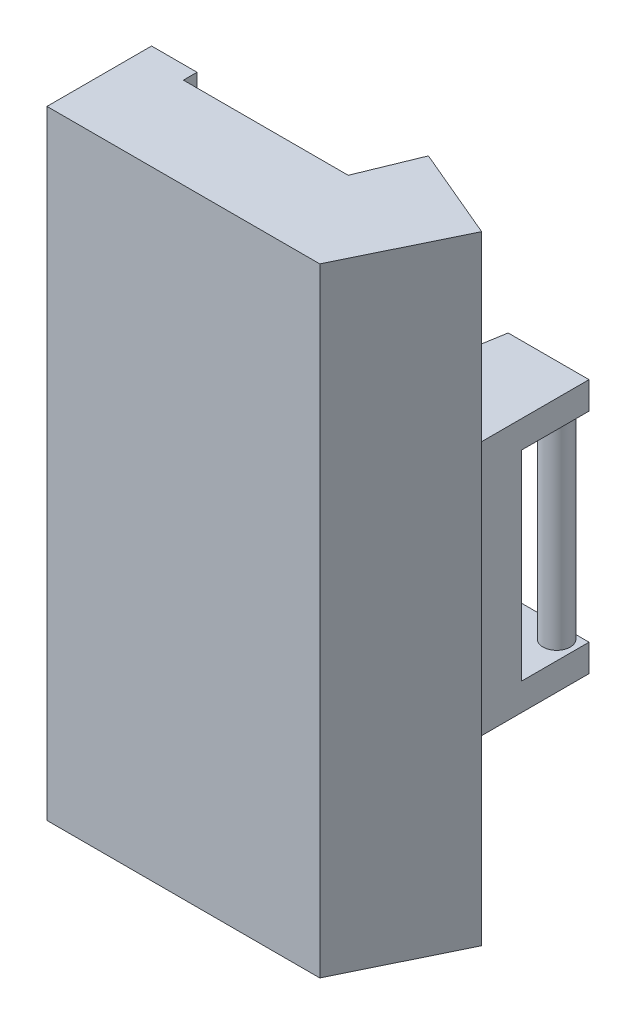
ISO-10303-21;
HEADER;
FILE_DESCRIPTION(('STEP AP214'),'2;1');
FILE_NAME('part.step','',(''),(''),'','','');
FILE_SCHEMA(('AUTOMOTIVE_DESIGN { 1 0 10303 214 1 1 1 1 }'));
ENDSEC;
DATA;
#1=APPLICATION_CONTEXT('core data for automotive mechanical design processes');
#2=APPLICATION_PROTOCOL_DEFINITION('international standard','automotive_design',2000,#1);
#3=PRODUCT_CONTEXT('',#1,'mechanical');
#4=PRODUCT('Part','Part','',(#3));
#5=PRODUCT_RELATED_PRODUCT_CATEGORY('part','',(#4));
#6=PRODUCT_DEFINITION_FORMATION('','',#4);
#7=PRODUCT_DEFINITION_CONTEXT('part definition',#1,'design');
#8=PRODUCT_DEFINITION('design','',#6,#7);
#9=PRODUCT_DEFINITION_SHAPE('','',#8);
#10=(LENGTH_UNIT() NAMED_UNIT(*) SI_UNIT(.MILLI.,.METRE.));
#11=(NAMED_UNIT(*) PLANE_ANGLE_UNIT() SI_UNIT($,.RADIAN.));
#12=(NAMED_UNIT(*) SI_UNIT($,.STERADIAN.) SOLID_ANGLE_UNIT());
#13=UNCERTAINTY_MEASURE_WITH_UNIT(LENGTH_MEASURE(1.E-05),#10,'distance_accuracy_value','');
#14=(GEOMETRIC_REPRESENTATION_CONTEXT(3) GLOBAL_UNCERTAINTY_ASSIGNED_CONTEXT((#13)) GLOBAL_UNIT_ASSIGNED_CONTEXT((#10,
#11,#12)) REPRESENTATION_CONTEXT('',''));
#15=CARTESIAN_POINT('',(0.,0.,0.));
#16=DIRECTION('',(0.,0.,1.));
#17=DIRECTION('',(1.,0.,0.));
#18=AXIS2_PLACEMENT_3D('',#15,#16,#17);
#19=CARTESIAN_POINT('',(-8.07585957060305,-14.,6.02122041871292));
#20=DIRECTION('',(0.0115152494966304,0.,0.999933697316492));
#21=DIRECTION('',(0.999933697316492,0.,-0.0115152494966304));
#22=AXIS2_PLACEMENT_3D('',#19,#20,#21);
#23=PLANE('',#22);
#24=DIRECTION('',(0.999933697316492,0.,-0.0115152494966304));
#25=VECTOR('',#24,1.);
#26=CARTESIAN_POINT('',(-8.07585957060305,11.,6.02122041871292));
#27=LINE('',#26,#25);
#28=CARTESIAN_POINT('',(-8.07585957060305,11.,6.02122041871292));
#29=VERTEX_POINT('',#28);
#30=CARTESIAN_POINT('',(2.06168322570368,11.,5.90447634368522));
#31=VERTEX_POINT('',#30);
#32=EDGE_CURVE('E61',#29,#31,#27,.T.);
#33=ORIENTED_EDGE('',*,*,#32,.T.);
#34=DIRECTION('',(0.,1.,0.));
#35=VECTOR('',#34,1.);
#36=CARTESIAN_POINT('',(2.06168322570368,-14.,5.90447634368522));
#37=LINE('',#36,#35);
#38=CARTESIAN_POINT('',(2.06168322570368,-11.,5.90447634368522));
#39=VERTEX_POINT('',#38);
#40=EDGE_CURVE('E317',#39,#31,#37,.T.);
#41=ORIENTED_EDGE('',*,*,#40,.F.);
#42=DIRECTION('',(-0.999933697316492,0.,0.0115152494966304));
#43=VECTOR('',#42,1.);
#44=CARTESIAN_POINT('',(-8.07585957060305,-11.,6.02122041871292));
#45=LINE('',#44,#43);
#46=CARTESIAN_POINT('',(-8.07585957060305,-11.,6.02122041871292));
#47=VERTEX_POINT('',#46);
#48=EDGE_CURVE('E339',#39,#47,#45,.T.);
#49=ORIENTED_EDGE('',*,*,#48,.T.);
#50=DIRECTION('',(0.,1.,0.));
#51=VECTOR('',#50,1.);
#52=CARTESIAN_POINT('',(-8.07585957060305,-14.,6.02122041871292));
#53=LINE('',#52,#51);
#54=EDGE_CURVE('E320',#47,#29,#53,.T.);
#55=ORIENTED_EDGE('',*,*,#54,.T.);
#56=EDGE_LOOP('',(#33,#41,#49,#55));
#57=FACE_BOUND('',#56,.T.);
#58=ADVANCED_FACE('F45',(#57),#23,.F.);
#59=CARTESIAN_POINT('',(0.,-11.,0.));
#60=DIRECTION('',(0.,1.,0.));
#61=DIRECTION('',(0.,0.,1.));
#62=AXIS2_PLACEMENT_3D('',#59,#60,#61);
#63=CYLINDRICAL_SURFACE('',#62,1.5);
#64=CARTESIAN_POINT('',(0.,-11.,0.));
#65=DIRECTION('',(0.,1.,0.));
#66=DIRECTION('',(0.,0.,1.));
#67=AXIS2_PLACEMENT_3D('',#64,#65,#66);
#68=CIRCLE('',#67,1.5);
#69=CARTESIAN_POINT('',(0.,-11.,-1.5));
#70=VERTEX_POINT('',#69);
#71=EDGE_CURVE('E11',#70,#70,#68,.T.);
#72=ORIENTED_EDGE('',*,*,#71,.T.);
#73=EDGE_LOOP('',(#72));
#74=FACE_BOUND('',#73,.T.);
#75=CARTESIAN_POINT('',(0.,11.,0.));
#76=DIRECTION('',(0.,1.,0.));
#77=DIRECTION('',(0.,0.,1.));
#78=AXIS2_PLACEMENT_3D('',#75,#76,#77);
#79=CIRCLE('',#78,1.5);
#80=CARTESIAN_POINT('',(0.,11.,-1.5));
#81=VERTEX_POINT('',#80);
#82=EDGE_CURVE('E54',#81,#81,#79,.T.);
#83=ORIENTED_EDGE('',*,*,#82,.F.);
#84=EDGE_LOOP('',(#83));
#85=FACE_BOUND('',#84,.T.);
#86=ADVANCED_FACE('F47',(#74,#85),#63,.T.);
#87=CARTESIAN_POINT('',(2.06168322570368,-14.,5.90447634368522));
#88=DIRECTION('',(-1.,0.,0.));
#89=DIRECTION('',(0.,0.,1.));
#90=AXIS2_PLACEMENT_3D('',#87,#88,#89);
#91=PLANE('',#90);
#92=DIRECTION('',(0.,0.,1.));
#93=VECTOR('',#92,1.);
#94=CARTESIAN_POINT('',(2.06168322570368,-11.,5.90447634368522));
#95=LINE('',#94,#93);
#96=CARTESIAN_POINT('',(2.06168322570368,-11.,-1.5));
#97=VERTEX_POINT('',#96);
#98=EDGE_CURVE('E323',#97,#39,#95,.T.);
#99=ORIENTED_EDGE('',*,*,#98,.T.);
#100=ORIENTED_EDGE('',*,*,#40,.T.);
#101=DIRECTION('',(0.,0.,-1.));
#102=VECTOR('',#101,1.);
#103=CARTESIAN_POINT('',(2.06168322570368,11.,5.90447634368522));
#104=LINE('',#103,#102);
#105=CARTESIAN_POINT('',(2.06168322570368,11.,-1.5));
#106=VERTEX_POINT('',#105);
#107=EDGE_CURVE('E274',#31,#106,#104,.T.);
#108=ORIENTED_EDGE('',*,*,#107,.T.);
#109=DIRECTION('',(0.,-1.,0.));
#110=VECTOR('',#109,1.);
#111=CARTESIAN_POINT('',(2.06168322570368,14.,-1.5));
#112=LINE('',#111,#110);
#113=CARTESIAN_POINT('',(2.06168322570368,14.,-1.5));
#114=VERTEX_POINT('',#113);
#115=EDGE_CURVE('E302',#114,#106,#112,.T.);
#116=ORIENTED_EDGE('',*,*,#115,.F.);
#117=DIRECTION('',(0.,0.,1.));
#118=VECTOR('',#117,1.);
#119=CARTESIAN_POINT('',(2.06168322570368,14.,5.90447634368522));
#120=LINE('',#119,#118);
#121=CARTESIAN_POINT('',(2.06168322570368,14.,10.3089526873704));
#122=VERTEX_POINT('',#121);
#123=EDGE_CURVE('E306',#114,#122,#120,.T.);
#124=ORIENTED_EDGE('',*,*,#123,.T.);
#125=DIRECTION('',(0.,1.,0.));
#126=VECTOR('',#125,1.);
#127=CARTESIAN_POINT('',(2.06168322570368,-14.,10.3089526873704));
#128=LINE('',#127,#126);
#129=CARTESIAN_POINT('',(2.06168322570368,-14.,10.3089526873704));
#130=VERTEX_POINT('',#129);
#131=EDGE_CURVE('E181',#130,#122,#128,.T.);
#132=ORIENTED_EDGE('',*,*,#131,.F.);
#133=DIRECTION('',(0.,0.,1.));
#134=VECTOR('',#133,1.);
#135=CARTESIAN_POINT('',(2.06168322570368,-14.,5.90447634368522));
#136=LINE('',#135,#134);
#137=CARTESIAN_POINT('',(2.06168322570368,-14.,-1.5));
#138=VERTEX_POINT('',#137);
#139=EDGE_CURVE('E328',#138,#130,#136,.T.);
#140=ORIENTED_EDGE('',*,*,#139,.F.);
#141=DIRECTION('',(0.,1.,0.));
#142=VECTOR('',#141,1.);
#143=CARTESIAN_POINT('',(2.06168322570368,-14.,-1.5));
#144=LINE('',#143,#142);
#145=EDGE_CURVE('E356',#138,#97,#144,.T.);
#146=ORIENTED_EDGE('',*,*,#145,.T.);
#147=EDGE_LOOP('',(#99,#100,#108,#116,#124,#132,#140,#146));
#148=FACE_BOUND('',#147,.T.);
#149=ADVANCED_FACE('F368',(#148),#91,.F.);
#150=CARTESIAN_POINT('',(-6.83185883933583,-14.,-1.5));
#151=DIRECTION('',(0.986596019256481,0.,0.163181784483644));
#152=DIRECTION('',(0.163181784483644,0.,-0.986596019256481));
#153=AXIS2_PLACEMENT_3D('',#150,#151,#152);
#154=PLANE('',#153);
#155=DIRECTION('',(0.163181784483644,0.,-0.98659601925648));
#156=VECTOR('',#155,1.);
#157=CARTESIAN_POINT('',(-6.83185883933583,-11.,-1.5));
#158=LINE('',#157,#156);
#159=CARTESIAN_POINT('',(-6.83185883933583,-11.,-1.5));
#160=VERTEX_POINT('',#159);
#161=EDGE_CURVE('E343',#47,#160,#158,.T.);
#162=ORIENTED_EDGE('',*,*,#161,.T.);
#163=DIRECTION('',(0.,1.,0.));
#164=VECTOR('',#163,1.);
#165=CARTESIAN_POINT('',(-6.83185883933583,-14.,-1.5));
#166=LINE('',#165,#164);
#167=CARTESIAN_POINT('',(-6.83185883933583,-14.,-1.5));
#168=VERTEX_POINT('',#167);
#169=EDGE_CURVE('E336',#168,#160,#166,.T.);
#170=ORIENTED_EDGE('',*,*,#169,.F.);
#171=DIRECTION('',(0.163181784483644,0.,-0.98659601925648));
#172=VECTOR('',#171,1.);
#173=CARTESIAN_POINT('',(-6.83185883933583,-14.,-1.5));
#174=LINE('',#173,#172);
#175=CARTESIAN_POINT('',(-8.07585957060305,-14.,6.02122041871292));
#176=VERTEX_POINT('',#175);
#177=EDGE_CURVE('E332',#176,#168,#174,.T.);
#178=ORIENTED_EDGE('',*,*,#177,.F.);
#179=DIRECTION('',(0.,1.,0.));
#180=VECTOR('',#179,1.);
#181=CARTESIAN_POINT('',(-8.07585957060305,-14.,6.02122041871292));
#182=LINE('',#181,#180);
#183=EDGE_CURVE('E352',#176,#47,#182,.T.);
#184=ORIENTED_EDGE('',*,*,#183,.T.);
#185=EDGE_LOOP('',(#162,#170,#178,#184));
#186=FACE_BOUND('',#185,.T.);
#187=ADVANCED_FACE('F375',(#186),#154,.F.);
#188=CARTESIAN_POINT('',(0.,-14.,-1.5));
#189=DIRECTION('',(0.,0.,1.));
#190=DIRECTION('',(1.,0.,0.));
#191=AXIS2_PLACEMENT_3D('',#188,#189,#190);
#192=PLANE('',#191);
#193=DIRECTION('',(1.,0.,0.));
#194=VECTOR('',#193,1.);
#195=CARTESIAN_POINT('',(0.,-11.,-1.5));
#196=LINE('',#195,#194);
#197=EDGE_CURVE('E329',#160,#70,#196,.T.);
#198=ORIENTED_EDGE('',*,*,#197,.T.);
#199=EDGE_CURVE('E346',#70,#97,#196,.T.);
#200=ORIENTED_EDGE('',*,*,#199,.T.);
#201=ORIENTED_EDGE('',*,*,#145,.F.);
#202=DIRECTION('',(1.,0.,0.));
#203=VECTOR('',#202,1.);
#204=CARTESIAN_POINT('',(2.06168322570368,-14.,-1.5));
#205=LINE('',#204,#203);
#206=EDGE_CURVE('E324',#168,#138,#205,.T.);
#207=ORIENTED_EDGE('',*,*,#206,.F.);
#208=ORIENTED_EDGE('',*,*,#169,.T.);
#209=EDGE_LOOP('',(#198,#200,#201,#207,#208));
#210=FACE_BOUND('',#209,.T.);
#211=ADVANCED_FACE('F414',(#210),#192,.F.);
#212=CARTESIAN_POINT('',(0.,-14.,0.));
#213=DIRECTION('',(0.,-1.,0.));
#214=DIRECTION('',(0.,0.,-1.));
#215=AXIS2_PLACEMENT_3D('',#212,#213,#214);
#216=PLANE('',#215);
#217=DIRECTION('',(0.92100728562618,0.,0.389545350150013));
#218=VECTOR('',#217,1.);
#219=CARTESIAN_POINT('',(-3.38573396327762,-14.,8.00493612918199));
#220=LINE('',#219,#218);
#221=EDGE_CURVE('E261',#176,#130,#220,.T.);
#222=ORIENTED_EDGE('',*,*,#221,.F.);
#223=ORIENTED_EDGE('',*,*,#177,.T.);
#224=ORIENTED_EDGE('',*,*,#206,.T.);
#225=ORIENTED_EDGE('',*,*,#139,.T.);
#226=EDGE_LOOP('',(#222,#223,#224,#225));
#227=FACE_BOUND('',#226,.T.);
#228=ADVANCED_FACE('F413',(#227),#216,.T.);
#229=CARTESIAN_POINT('',(0.,-11.,0.));
#230=DIRECTION('',(0.,-1.,0.));
#231=DIRECTION('',(0.,0.,-1.));
#232=AXIS2_PLACEMENT_3D('',#229,#230,#231);
#233=PLANE('',#232);
#234=ORIENTED_EDGE('',*,*,#199,.F.);
#235=ORIENTED_EDGE('',*,*,#71,.F.);
#236=ORIENTED_EDGE('',*,*,#197,.F.);
#237=ORIENTED_EDGE('',*,*,#161,.F.);
#238=ORIENTED_EDGE('',*,*,#48,.F.);
#239=ORIENTED_EDGE('',*,*,#98,.F.);
#240=EDGE_LOOP('',(#234,#235,#236,#237,#238,#239));
#241=FACE_BOUND('',#240,.T.);
#242=ADVANCED_FACE('F382',(#241),#233,.F.);
#243=CARTESIAN_POINT('',(-8.07585957060305,-14.,6.02122041871292));
#244=DIRECTION('',(0.92559022048105,0.,0.378527071356648));
#245=DIRECTION('',(0.378527071356648,0.,-0.92559022048105));
#246=AXIS2_PLACEMENT_3D('',#243,#244,#245);
#247=PLANE('',#246);
#248=DIRECTION('',(0.,1.,0.));
#249=VECTOR('',#248,1.);
#250=CARTESIAN_POINT('',(-10.6353825218464,-14.,12.2798729485752));
#251=LINE('',#250,#249);
#252=CARTESIAN_POINT('',(-10.6353825218464,-34.,12.2798729485752));
#253=VERTEX_POINT('',#252);
#254=CARTESIAN_POINT('',(-10.6353825218464,34.,12.2798729485752));
#255=VERTEX_POINT('',#254);
#256=EDGE_CURVE('E310',#253,#255,#251,.T.);
#257=ORIENTED_EDGE('',*,*,#256,.T.);
#258=DIRECTION('',(0.378527071356648,0.,-0.92559022048105));
#259=VECTOR('',#258,1.);
#260=CARTESIAN_POINT('',(-8.07585957060305,34.,6.02122041871292));
#261=LINE('',#260,#259);
#262=CARTESIAN_POINT('',(-8.07585957060305,34.,6.02122041871292));
#263=VERTEX_POINT('',#262);
#264=EDGE_CURVE('E241',#255,#263,#261,.T.);
#265=ORIENTED_EDGE('',*,*,#264,.T.);
#266=DIRECTION('',(0.,-1.,0.));
#267=VECTOR('',#266,1.);
#268=CARTESIAN_POINT('',(-8.07585957060305,34.,6.02122041871292));
#269=LINE('',#268,#267);
#270=CARTESIAN_POINT('',(-8.07585957060305,14.,6.02122041871292));
#271=VERTEX_POINT('',#270);
#272=EDGE_CURVE('E255',#263,#271,#269,.T.);
#273=ORIENTED_EDGE('',*,*,#272,.T.);
#274=DIRECTION('',(0.,-1.,0.));
#275=VECTOR('',#274,1.);
#276=CARTESIAN_POINT('',(-8.07585957060305,14.,6.02122041871292));
#277=LINE('',#276,#275);
#278=EDGE_CURVE('E69',#271,#29,#277,.T.);
#279=ORIENTED_EDGE('',*,*,#278,.T.);
#280=ORIENTED_EDGE('',*,*,#54,.F.);
#281=ORIENTED_EDGE('',*,*,#183,.F.);
#282=CARTESIAN_POINT('',(-8.07585957060305,-34.,6.02122041871292));
#283=VERTEX_POINT('',#282);
#284=EDGE_CURVE('E249',#176,#283,#269,.T.);
#285=ORIENTED_EDGE('',*,*,#284,.T.);
#286=DIRECTION('',(0.378527071356648,0.,-0.92559022048105));
#287=VECTOR('',#286,1.);
#288=CARTESIAN_POINT('',(-8.07585957060305,-34.,6.02122041871292));
#289=LINE('',#288,#287);
#290=EDGE_CURVE('E215',#253,#283,#289,.T.);
#291=ORIENTED_EDGE('',*,*,#290,.F.);
#292=EDGE_LOOP('',(#257,#265,#273,#279,#280,#281,#285,#291));
#293=FACE_BOUND('',#292,.T.);
#294=ADVANCED_FACE('F394',(#293),#247,.F.);
#295=CARTESIAN_POINT('',(2.06168322570368,-14.,10.3089526873704));
#296=DIRECTION('',(-0.899305820238499,0.,-0.437320296447765));
#297=DIRECTION('',(-0.437320296447765,0.,0.899305820238499));
#298=AXIS2_PLACEMENT_3D('',#295,#296,#297);
#299=PLANE('',#298);
#300=ORIENTED_EDGE('',*,*,#131,.T.);
#301=DIRECTION('',(0.,-1.,0.));
#302=VECTOR('',#301,1.);
#303=CARTESIAN_POINT('',(2.06168322570368,34.,10.3089526873704));
#304=LINE('',#303,#302);
#305=CARTESIAN_POINT('',(2.06168322570368,34.,10.3089526873704));
#306=VERTEX_POINT('',#305);
#307=EDGE_CURVE('E250',#306,#122,#304,.T.);
#308=ORIENTED_EDGE('',*,*,#307,.F.);
#309=DIRECTION('',(-0.437320296447765,0.,0.899305820238499));
#310=VECTOR('',#309,1.);
#311=CARTESIAN_POINT('',(-3.75961391212009,34.,22.2798729485752));
#312=LINE('',#311,#310);
#313=CARTESIAN_POINT('',(-3.75961391212009,34.,22.2798729485752));
#314=VERTEX_POINT('',#313);
#315=EDGE_CURVE('E176',#306,#314,#312,.T.);
#316=ORIENTED_EDGE('',*,*,#315,.T.);
#317=DIRECTION('',(0.,1.,0.));
#318=VECTOR('',#317,1.);
#319=CARTESIAN_POINT('',(-3.75961391212009,-14.,22.2798729485752));
#320=LINE('',#319,#318);
#321=CARTESIAN_POINT('',(-3.75961391212009,-34.,22.2798729485752));
#322=VERTEX_POINT('',#321);
#323=EDGE_CURVE('E168',#322,#314,#320,.T.);
#324=ORIENTED_EDGE('',*,*,#323,.F.);
#325=DIRECTION('',(-0.437320296447765,0.,0.899305820238499));
#326=VECTOR('',#325,1.);
#327=CARTESIAN_POINT('',(-3.75961391212009,-34.,22.2798729485752));
#328=LINE('',#327,#326);
#329=CARTESIAN_POINT('',(2.06168322570368,-34.,10.3089526873704));
#330=VERTEX_POINT('',#329);
#331=EDGE_CURVE('E174',#330,#322,#328,.T.);
#332=ORIENTED_EDGE('',*,*,#331,.F.);
#333=EDGE_CURVE('E254',#130,#330,#304,.T.);
#334=ORIENTED_EDGE('',*,*,#333,.F.);
#335=EDGE_LOOP('',(#300,#308,#316,#324,#332,#334));
#336=FACE_BOUND('',#335,.T.);
#337=ADVANCED_FACE('F171',(#336),#299,.F.);
#338=CARTESIAN_POINT('',(-3.75961391212009,-14.,22.2798729485752));
#339=DIRECTION('',(0.,0.,-1.));
#340=DIRECTION('',(-1.,0.,0.));
#341=AXIS2_PLACEMENT_3D('',#338,#339,#340);
#342=PLANE('',#341);
#343=ORIENTED_EDGE('',*,*,#323,.T.);
#344=DIRECTION('',(-1.,0.,0.));
#345=VECTOR('',#344,1.);
#346=CARTESIAN_POINT('',(-33.7596139121201,34.,22.2798729485752));
#347=LINE('',#346,#345);
#348=CARTESIAN_POINT('',(-33.7596139121201,34.,22.2798729485752));
#349=VERTEX_POINT('',#348);
#350=EDGE_CURVE('E222',#314,#349,#347,.T.);
#351=ORIENTED_EDGE('',*,*,#350,.T.);
#352=DIRECTION('',(0.,1.,0.));
#353=VECTOR('',#352,1.);
#354=CARTESIAN_POINT('',(-33.7596139121201,-14.,22.2798729485752));
#355=LINE('',#354,#353);
#356=CARTESIAN_POINT('',(-33.7596139121201,-34.,22.2798729485752));
#357=VERTEX_POINT('',#356);
#358=EDGE_CURVE('E182',#357,#349,#355,.T.);
#359=ORIENTED_EDGE('',*,*,#358,.F.);
#360=DIRECTION('',(-1.,0.,0.));
#361=VECTOR('',#360,1.);
#362=CARTESIAN_POINT('',(-33.7596139121201,-34.,22.2798729485752));
#363=LINE('',#362,#361);
#364=EDGE_CURVE('E185',#322,#357,#363,.T.);
#365=ORIENTED_EDGE('',*,*,#364,.F.);
#366=EDGE_LOOP('',(#343,#351,#359,#365));
#367=FACE_BOUND('',#366,.T.);
#368=ADVANCED_FACE('F186',(#367),#342,.F.);
#369=CARTESIAN_POINT('',(-33.7596139121201,-14.,22.2798729485752));
#370=DIRECTION('',(1.,0.,0.));
#371=DIRECTION('',(0.,0.,-1.));
#372=AXIS2_PLACEMENT_3D('',#369,#370,#371);
#373=PLANE('',#372);
#374=ORIENTED_EDGE('',*,*,#358,.T.);
#375=DIRECTION('',(0.,0.,-1.));
#376=VECTOR('',#375,1.);
#377=CARTESIAN_POINT('',(-33.7596139121201,34.,10.7798729485752));
#378=LINE('',#377,#376);
#379=CARTESIAN_POINT('',(-33.7596139121201,34.,10.7798729485752));
#380=VERTEX_POINT('',#379);
#381=EDGE_CURVE('E225',#349,#380,#378,.T.);
#382=ORIENTED_EDGE('',*,*,#381,.T.);
#383=DIRECTION('',(0.,1.,0.));
#384=VECTOR('',#383,1.);
#385=CARTESIAN_POINT('',(-33.7596139121201,-19.2201532544553,10.7798729485752));
#386=LINE('',#385,#384);
#387=CARTESIAN_POINT('',(-33.7596139121201,-34.,10.7798729485752));
#388=VERTEX_POINT('',#387);
#389=EDGE_CURVE('E266',#388,#380,#386,.T.);
#390=ORIENTED_EDGE('',*,*,#389,.F.);
#391=DIRECTION('',(0.,0.,-1.));
#392=VECTOR('',#391,1.);
#393=CARTESIAN_POINT('',(-33.7596139121201,-34.,10.7798729485752));
#394=LINE('',#393,#392);
#395=EDGE_CURVE('E191',#357,#388,#394,.T.);
#396=ORIENTED_EDGE('',*,*,#395,.F.);
#397=EDGE_LOOP('',(#374,#382,#390,#396));
#398=FACE_BOUND('',#397,.T.);
#399=ADVANCED_FACE('F432',(#398),#373,.F.);
#400=CARTESIAN_POINT('',(-33.7596139121201,-14.,12.2798729485752));
#401=DIRECTION('',(0.,0.,1.));
#402=DIRECTION('',(1.,0.,0.));
#403=AXIS2_PLACEMENT_3D('',#400,#401,#402);
#404=PLANE('',#403);
#405=ORIENTED_EDGE('',*,*,#256,.F.);
#406=DIRECTION('',(1.,0.,0.));
#407=VECTOR('',#406,1.);
#408=CARTESIAN_POINT('',(-10.6353825218464,-34.,12.2798729485752));
#409=LINE('',#408,#407);
#410=CARTESIAN_POINT('',(-28.7596139121201,-34.,12.2798729485752));
#411=VERTEX_POINT('',#410);
#412=EDGE_CURVE('E211',#411,#253,#409,.T.);
#413=ORIENTED_EDGE('',*,*,#412,.F.);
#414=DIRECTION('',(0.,1.,0.));
#415=VECTOR('',#414,1.);
#416=CARTESIAN_POINT('',(-28.7596139121201,-19.2201532544553,12.2798729485752));
#417=LINE('',#416,#415);
#418=CARTESIAN_POINT('',(-28.7596139121201,34.,12.2798729485752));
#419=VERTEX_POINT('',#418);
#420=EDGE_CURVE('E269',#411,#419,#417,.T.);
#421=ORIENTED_EDGE('',*,*,#420,.T.);
#422=DIRECTION('',(1.,0.,0.));
#423=VECTOR('',#422,1.);
#424=CARTESIAN_POINT('',(-10.6353825218464,34.,12.2798729485752));
#425=LINE('',#424,#423);
#426=EDGE_CURVE('E237',#419,#255,#425,.T.);
#427=ORIENTED_EDGE('',*,*,#426,.T.);
#428=EDGE_LOOP('',(#405,#413,#421,#427));
#429=FACE_BOUND('',#428,.T.);
#430=ADVANCED_FACE('F435',(#429),#404,.F.);
#431=CARTESIAN_POINT('',(0.,14.,0.));
#432=DIRECTION('',(0.,-1.,0.));
#433=DIRECTION('',(0.,0.,-1.));
#434=AXIS2_PLACEMENT_3D('',#431,#432,#433);
#435=PLANE('',#434);
#436=DIRECTION('',(-0.163181784483644,0.,0.98659601925648));
#437=VECTOR('',#436,1.);
#438=CARTESIAN_POINT('',(-6.83185883933583,14.,-1.5));
#439=LINE('',#438,#437);
#440=CARTESIAN_POINT('',(-6.83185883933583,14.,-1.5));
#441=VERTEX_POINT('',#440);
#442=EDGE_CURVE('E278',#441,#271,#439,.T.);
#443=ORIENTED_EDGE('',*,*,#442,.T.);
#444=DIRECTION('',(0.92100728562618,0.,0.389545350150013));
#445=VECTOR('',#444,1.);
#446=CARTESIAN_POINT('',(-3.38573396327762,14.,8.00493612918199));
#447=LINE('',#446,#445);
#448=EDGE_CURVE('E253',#271,#122,#447,.T.);
#449=ORIENTED_EDGE('',*,*,#448,.T.);
#450=ORIENTED_EDGE('',*,*,#123,.F.);
#451=DIRECTION('',(-1.,0.,0.));
#452=VECTOR('',#451,1.);
#453=CARTESIAN_POINT('',(2.06168322570368,14.,-1.5));
#454=LINE('',#453,#452);
#455=EDGE_CURVE('E275',#114,#441,#454,.T.);
#456=ORIENTED_EDGE('',*,*,#455,.T.);
#457=EDGE_LOOP('',(#443,#449,#450,#456));
#458=FACE_BOUND('',#457,.T.);
#459=ADVANCED_FACE('F402',(#458),#435,.F.);
#460=CARTESIAN_POINT('',(0.,11.,0.));
#461=DIRECTION('',(0.,1.,0.));
#462=DIRECTION('',(0.,0.,1.));
#463=AXIS2_PLACEMENT_3D('',#460,#461,#462);
#464=PLANE('',#463);
#465=DIRECTION('',(-1.,0.,0.));
#466=VECTOR('',#465,1.);
#467=CARTESIAN_POINT('',(2.06168322570368,11.,-1.5));
#468=LINE('',#467,#466);
#469=CARTESIAN_POINT('',(-6.83185883933583,11.,-1.5));
#470=VERTEX_POINT('',#469);
#471=EDGE_CURVE('E285',#81,#470,#468,.T.);
#472=ORIENTED_EDGE('',*,*,#471,.F.);
#473=ORIENTED_EDGE('',*,*,#82,.T.);
#474=EDGE_CURVE('E286',#106,#81,#468,.T.);
#475=ORIENTED_EDGE('',*,*,#474,.F.);
#476=ORIENTED_EDGE('',*,*,#107,.F.);
#477=ORIENTED_EDGE('',*,*,#32,.F.);
#478=DIRECTION('',(-0.163181784483644,0.,0.98659601925648));
#479=VECTOR('',#478,1.);
#480=CARTESIAN_POINT('',(-6.83185883933583,11.,-1.5));
#481=LINE('',#480,#479);
#482=EDGE_CURVE('E290',#470,#29,#481,.T.);
#483=ORIENTED_EDGE('',*,*,#482,.F.);
#484=EDGE_LOOP('',(#472,#473,#475,#476,#477,#483));
#485=FACE_BOUND('',#484,.T.);
#486=ADVANCED_FACE('F363',(#485),#464,.F.);
#487=CARTESIAN_POINT('',(2.06168322570368,14.,-1.5));
#488=DIRECTION('',(0.,0.,1.));
#489=DIRECTION('',(1.,0.,0.));
#490=AXIS2_PLACEMENT_3D('',#487,#488,#489);
#491=PLANE('',#490);
#492=ORIENTED_EDGE('',*,*,#474,.T.);
#493=ORIENTED_EDGE('',*,*,#471,.T.);
#494=DIRECTION('',(0.,-1.,0.));
#495=VECTOR('',#494,1.);
#496=CARTESIAN_POINT('',(-6.83185883933583,14.,-1.5));
#497=LINE('',#496,#495);
#498=EDGE_CURVE('E298',#441,#470,#497,.T.);
#499=ORIENTED_EDGE('',*,*,#498,.F.);
#500=ORIENTED_EDGE('',*,*,#455,.F.);
#501=ORIENTED_EDGE('',*,*,#115,.T.);
#502=EDGE_LOOP('',(#492,#493,#499,#500,#501));
#503=FACE_BOUND('',#502,.T.);
#504=ADVANCED_FACE('F405',(#503),#491,.F.);
#505=CARTESIAN_POINT('',(-6.83185883933583,14.,-1.5));
#506=DIRECTION('',(0.986596019256481,0.,0.163181784483644));
#507=DIRECTION('',(0.163181784483644,0.,-0.986596019256481));
#508=AXIS2_PLACEMENT_3D('',#505,#506,#507);
#509=PLANE('',#508);
#510=ORIENTED_EDGE('',*,*,#482,.T.);
#511=ORIENTED_EDGE('',*,*,#278,.F.);
#512=ORIENTED_EDGE('',*,*,#442,.F.);
#513=ORIENTED_EDGE('',*,*,#498,.T.);
#514=EDGE_LOOP('',(#510,#511,#512,#513));
#515=FACE_BOUND('',#514,.T.);
#516=ADVANCED_FACE('F408',(#515),#509,.F.);
#517=CARTESIAN_POINT('',(-28.7596139121201,-19.2201532544553,10.7798729485752));
#518=DIRECTION('',(1.,0.,0.));
#519=DIRECTION('',(0.,0.,-1.));
#520=AXIS2_PLACEMENT_3D('',#517,#518,#519);
#521=PLANE('',#520);
#522=ORIENTED_EDGE('',*,*,#420,.F.);
#523=DIRECTION('',(0.,0.,1.));
#524=VECTOR('',#523,1.);
#525=CARTESIAN_POINT('',(-28.7596139121201,-34.,12.2798729485752));
#526=LINE('',#525,#524);
#527=CARTESIAN_POINT('',(-28.7596139121201,-34.,10.7798729485752));
#528=VERTEX_POINT('',#527);
#529=EDGE_CURVE('E207',#528,#411,#526,.T.);
#530=ORIENTED_EDGE('',*,*,#529,.F.);
#531=DIRECTION('',(0.,1.,0.));
#532=VECTOR('',#531,1.);
#533=CARTESIAN_POINT('',(-28.7596139121201,-19.2201532544553,10.7798729485752));
#534=LINE('',#533,#532);
#535=CARTESIAN_POINT('',(-28.7596139121201,34.,10.7798729485752));
#536=VERTEX_POINT('',#535);
#537=EDGE_CURVE('E265',#528,#536,#534,.T.);
#538=ORIENTED_EDGE('',*,*,#537,.T.);
#539=DIRECTION('',(0.,0.,1.));
#540=VECTOR('',#539,1.);
#541=CARTESIAN_POINT('',(-28.7596139121201,34.,12.2798729485752));
#542=LINE('',#541,#540);
#543=EDGE_CURVE('E233',#536,#419,#542,.T.);
#544=ORIENTED_EDGE('',*,*,#543,.T.);
#545=EDGE_LOOP('',(#522,#530,#538,#544));
#546=FACE_BOUND('',#545,.T.);
#547=ADVANCED_FACE('F446',(#546),#521,.T.);
#548=CARTESIAN_POINT('',(-33.7596139121201,-19.2201532544553,10.7798729485752));
#549=DIRECTION('',(0.,0.,-1.));
#550=DIRECTION('',(-1.,0.,0.));
#551=AXIS2_PLACEMENT_3D('',#548,#549,#550);
#552=PLANE('',#551);
#553=ORIENTED_EDGE('',*,*,#537,.F.);
#554=DIRECTION('',(1.,0.,0.));
#555=VECTOR('',#554,1.);
#556=CARTESIAN_POINT('',(-28.7596139121201,-34.,10.7798729485752));
#557=LINE('',#556,#555);
#558=EDGE_CURVE('E203',#388,#528,#557,.T.);
#559=ORIENTED_EDGE('',*,*,#558,.F.);
#560=ORIENTED_EDGE('',*,*,#389,.T.);
#561=DIRECTION('',(1.,0.,0.));
#562=VECTOR('',#561,1.);
#563=CARTESIAN_POINT('',(-28.7596139121201,34.,10.7798729485752));
#564=LINE('',#563,#562);
#565=EDGE_CURVE('E229',#380,#536,#564,.T.);
#566=ORIENTED_EDGE('',*,*,#565,.T.);
#567=EDGE_LOOP('',(#553,#559,#560,#566));
#568=FACE_BOUND('',#567,.T.);
#569=ADVANCED_FACE('F450',(#568),#552,.T.);
#570=CARTESIAN_POINT('',(0.,34.,0.));
#571=DIRECTION('',(0.,1.,0.));
#572=DIRECTION('',(0.,0.,1.));
#573=AXIS2_PLACEMENT_3D('',#570,#571,#572);
#574=PLANE('',#573);
#575=ORIENTED_EDGE('',*,*,#315,.F.);
#576=DIRECTION('',(0.92100728562618,0.,0.389545350150013));
#577=VECTOR('',#576,1.);
#578=CARTESIAN_POINT('',(2.06168322570368,34.,10.3089526873704));
#579=LINE('',#578,#577);
#580=EDGE_CURVE('E245',#263,#306,#579,.T.);
#581=ORIENTED_EDGE('',*,*,#580,.F.);
#582=ORIENTED_EDGE('',*,*,#264,.F.);
#583=ORIENTED_EDGE('',*,*,#426,.F.);
#584=ORIENTED_EDGE('',*,*,#543,.F.);
#585=ORIENTED_EDGE('',*,*,#565,.F.);
#586=ORIENTED_EDGE('',*,*,#381,.F.);
#587=ORIENTED_EDGE('',*,*,#350,.F.);
#588=EDGE_LOOP('',(#575,#581,#582,#583,#584,#585,#586,#587));
#589=FACE_BOUND('',#588,.T.);
#590=ADVANCED_FACE('F454',(#589),#574,.T.);
#591=CARTESIAN_POINT('',(2.06168322570368,34.,10.3089526873704));
#592=DIRECTION('',(0.389545350150013,0.,-0.92100728562618));
#593=DIRECTION('',(-0.92100728562618,0.,-0.389545350150013));
#594=AXIS2_PLACEMENT_3D('',#591,#592,#593);
#595=PLANE('',#594);
#596=ORIENTED_EDGE('',*,*,#448,.F.);
#597=ORIENTED_EDGE('',*,*,#272,.F.);
#598=ORIENTED_EDGE('',*,*,#580,.T.);
#599=ORIENTED_EDGE('',*,*,#307,.T.);
#600=EDGE_LOOP('',(#596,#597,#598,#599));
#601=FACE_BOUND('',#600,.T.);
#602=ADVANCED_FACE('F458',(#601),#595,.T.);
#603=ORIENTED_EDGE('',*,*,#284,.F.);
#604=ORIENTED_EDGE('',*,*,#221,.T.);
#605=ORIENTED_EDGE('',*,*,#333,.T.);
#606=DIRECTION('',(0.92100728562618,0.,0.389545350150013));
#607=VECTOR('',#606,1.);
#608=CARTESIAN_POINT('',(2.06168322570368,-34.,10.3089526873704));
#609=LINE('',#608,#607);
#610=EDGE_CURVE('E197',#283,#330,#609,.T.);
#611=ORIENTED_EDGE('',*,*,#610,.F.);
#612=EDGE_LOOP('',(#603,#604,#605,#611));
#613=FACE_BOUND('',#612,.T.);
#614=ADVANCED_FACE('F397',(#613),#595,.T.);
#615=CARTESIAN_POINT('',(0.,-34.,0.));
#616=DIRECTION('',(0.,1.,0.));
#617=DIRECTION('',(0.,0.,1.));
#618=AXIS2_PLACEMENT_3D('',#615,#616,#617);
#619=PLANE('',#618);
#620=ORIENTED_EDGE('',*,*,#331,.T.);
#621=ORIENTED_EDGE('',*,*,#364,.T.);
#622=ORIENTED_EDGE('',*,*,#395,.T.);
#623=ORIENTED_EDGE('',*,*,#558,.T.);
#624=ORIENTED_EDGE('',*,*,#529,.T.);
#625=ORIENTED_EDGE('',*,*,#412,.T.);
#626=ORIENTED_EDGE('',*,*,#290,.T.);
#627=ORIENTED_EDGE('',*,*,#610,.T.);
#628=EDGE_LOOP('',(#620,#621,#622,#623,#624,#625,#626,#627));
#629=FACE_BOUND('',#628,.T.);
#630=ADVANCED_FACE('F194',(#629),#619,.F.);
#631=CLOSED_SHELL('',(#58,#86,#149,#187,#211,#228,#242,#294,#337,#368,#399,#430,#459,#486,#504,
#516,#547,#569,#590,#602,#614,#630));
#632=MANIFOLD_SOLID_BREP('B2',#631);
#633=ADVANCED_BREP_SHAPE_REPRESENTATION('',(#18,#632),#14);
#634=SHAPE_DEFINITION_REPRESENTATION(#9,#633);
ENDSEC;
END-ISO-10303-21;
